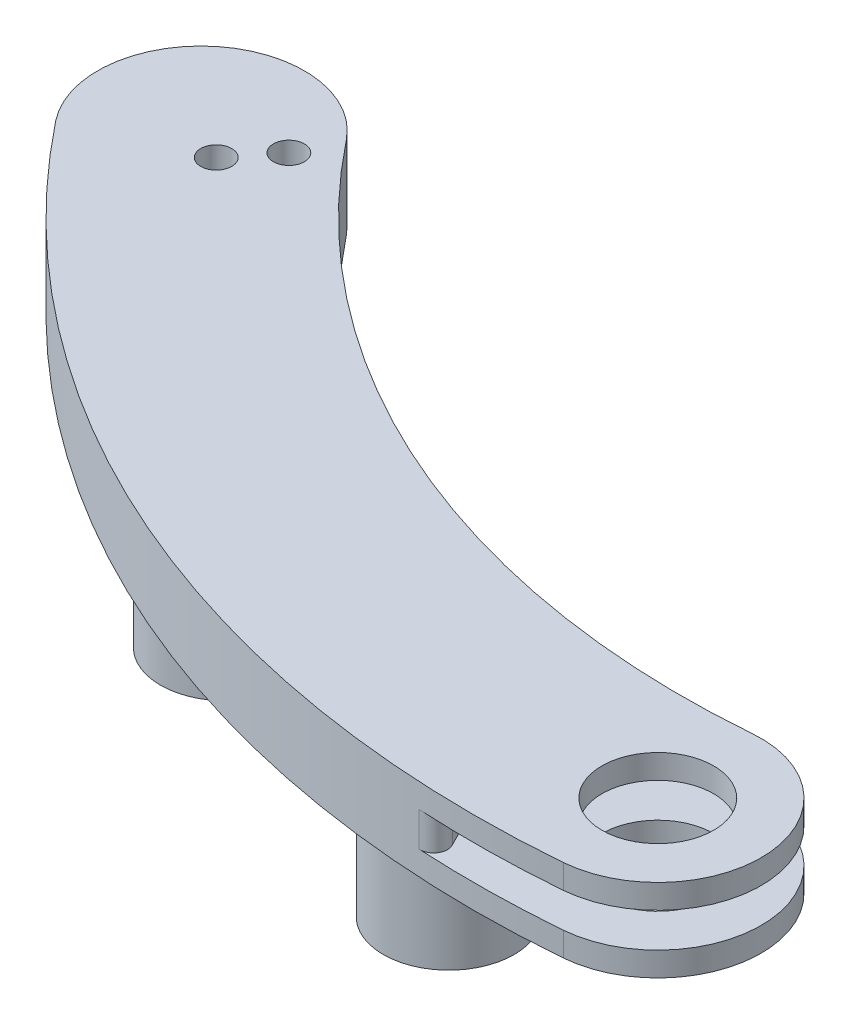
ISO-10303-21;
HEADER;
FILE_DESCRIPTION(('STEP AP214'),'2;1');
FILE_NAME('part.step','',(''),(''),'','','');
FILE_SCHEMA(('AUTOMOTIVE_DESIGN { 1 0 10303 214 1 1 1 1 }'));
ENDSEC;
DATA;
#1=APPLICATION_CONTEXT('core data for automotive mechanical design processes');
#2=APPLICATION_PROTOCOL_DEFINITION('international standard','automotive_design',2000,#1);
#3=PRODUCT_CONTEXT('',#1,'mechanical');
#4=PRODUCT('Part','Part','',(#3));
#5=PRODUCT_RELATED_PRODUCT_CATEGORY('part','',(#4));
#6=PRODUCT_DEFINITION_FORMATION('','',#4);
#7=PRODUCT_DEFINITION_CONTEXT('part definition',#1,'design');
#8=PRODUCT_DEFINITION('design','',#6,#7);
#9=PRODUCT_DEFINITION_SHAPE('','',#8);
#10=(LENGTH_UNIT() NAMED_UNIT(*) SI_UNIT(.MILLI.,.METRE.));
#11=(NAMED_UNIT(*) PLANE_ANGLE_UNIT() SI_UNIT($,.RADIAN.));
#12=(NAMED_UNIT(*) SI_UNIT($,.STERADIAN.) SOLID_ANGLE_UNIT());
#13=UNCERTAINTY_MEASURE_WITH_UNIT(LENGTH_MEASURE(1.E-05),#10,'distance_accuracy_value','');
#14=(GEOMETRIC_REPRESENTATION_CONTEXT(3) GLOBAL_UNCERTAINTY_ASSIGNED_CONTEXT((#13)) GLOBAL_UNIT_ASSIGNED_CONTEXT((#10,
#11,#12)) REPRESENTATION_CONTEXT('',''));
#15=CARTESIAN_POINT('',(0.,0.,0.));
#16=DIRECTION('',(0.,0.,1.));
#17=DIRECTION('',(1.,0.,0.));
#18=AXIS2_PLACEMENT_3D('',#15,#16,#17);
#19=CARTESIAN_POINT('',(-11.1561222970679,12.,-134.5382508259));
#20=DIRECTION('',(0.,-1.,0.));
#21=DIRECTION('',(0.,0.,-1.));
#22=AXIS2_PLACEMENT_3D('',#19,#20,#21);
#23=CYLINDRICAL_SURFACE('',#22,120.);
#24=DIRECTION('',(0.,-1.,0.));
#25=VECTOR('',#24,1.);
#26=CARTESIAN_POINT('',(-23.8009389622773,12.,-15.2063246221251));
#27=LINE('',#26,#25);
#28=CARTESIAN_POINT('',(-23.8009389622773,8.5,-15.2063246221251));
#29=VERTEX_POINT('',#28);
#30=CARTESIAN_POINT('',(-23.8009389622773,3.5,-15.2063246221251));
#31=VERTEX_POINT('',#30);
#32=EDGE_CURVE('E201',#29,#31,#27,.T.);
#33=ORIENTED_EDGE('',*,*,#32,.T.);
#34=CARTESIAN_POINT('',(-11.1561222970679,3.5,-134.5382508259));
#35=DIRECTION('',(0.,1.,0.));
#36=DIRECTION('',(0.,0.,1.));
#37=AXIS2_PLACEMENT_3D('',#34,#35,#36);
#38=CIRCLE('',#37,120.);
#39=CARTESIAN_POINT('',(-1.23956914411867,3.5,-14.9486945362111));
#40=VERTEX_POINT('',#39);
#41=EDGE_CURVE('E151',#31,#40,#38,.T.);
#42=ORIENTED_EDGE('',*,*,#41,.T.);
#43=DIRECTION('',(0.,-1.,0.));
#44=VECTOR('',#43,1.);
#45=CARTESIAN_POINT('',(-1.23956914411867,3.5,-14.9486945362111));
#46=LINE('',#45,#44);
#47=CARTESIAN_POINT('',(-1.23956914411867,0.,-14.9486945362111));
#48=VERTEX_POINT('',#47);
#49=EDGE_CURVE('E138',#40,#48,#46,.T.);
#50=ORIENTED_EDGE('',*,*,#49,.T.);
#51=CARTESIAN_POINT('',(-11.1561222970679,0.,-134.5382508259));
#52=DIRECTION('',(0.,1.,0.));
#53=DIRECTION('',(0.,0.,1.));
#54=AXIS2_PLACEMENT_3D('',#51,#52,#53);
#55=CIRCLE('',#54,120.);
#56=CARTESIAN_POINT('',(-105.239569144119,0.,-60.0513054637889));
#57=VERTEX_POINT('',#56);
#58=EDGE_CURVE('E178',#57,#48,#55,.T.);
#59=ORIENTED_EDGE('',*,*,#58,.F.);
#60=DIRECTION('',(0.,-1.,0.));
#61=VECTOR('',#60,1.);
#62=CARTESIAN_POINT('',(-105.239569144119,12.,-60.0513054637889));
#63=LINE('',#62,#61);
#64=CARTESIAN_POINT('',(-105.239569144119,12.,-60.0513054637889));
#65=VERTEX_POINT('',#64);
#66=EDGE_CURVE('E198',#65,#57,#63,.T.);
#67=ORIENTED_EDGE('',*,*,#66,.F.);
#68=CARTESIAN_POINT('',(-11.1561222970679,12.,-134.5382508259));
#69=DIRECTION('',(0.,1.,0.));
#70=DIRECTION('',(0.,0.,1.));
#71=AXIS2_PLACEMENT_3D('',#68,#69,#70);
#72=CIRCLE('',#71,120.);
#73=CARTESIAN_POINT('',(-1.23956914411867,12.,-14.9486945362111));
#74=VERTEX_POINT('',#73);
#75=EDGE_CURVE('E179',#65,#74,#72,.T.);
#76=ORIENTED_EDGE('',*,*,#75,.T.);
#77=DIRECTION('',(0.,-1.,0.));
#78=VECTOR('',#77,1.);
#79=CARTESIAN_POINT('',(-1.23956914411867,3.5,-14.9486945362111));
#80=LINE('',#79,#78);
#81=CARTESIAN_POINT('',(-1.23956914411867,8.5,-14.9486945362111));
#82=VERTEX_POINT('',#81);
#83=EDGE_CURVE('E170',#74,#82,#80,.T.);
#84=ORIENTED_EDGE('',*,*,#83,.T.);
#85=CARTESIAN_POINT('',(-11.1561222970679,8.5,-134.5382508259));
#86=DIRECTION('',(0.,1.,0.));
#87=DIRECTION('',(0.,0.,1.));
#88=AXIS2_PLACEMENT_3D('',#85,#86,#87);
#89=CIRCLE('',#88,120.);
#90=EDGE_CURVE('E137',#29,#82,#89,.T.);
#91=ORIENTED_EDGE('',*,*,#90,.F.);
#92=EDGE_LOOP('',(#33,#42,#50,#59,#67,#76,#84,#91));
#93=FACE_BOUND('',#92,.T.);
#94=ADVANCED_FACE('F41',(#93),#23,.F.);
#95=CARTESIAN_POINT('',(-11.1561222970679,12.,-134.5382508259));
#96=DIRECTION('',(0.,-1.,0.));
#97=DIRECTION('',(0.,0.,-1.));
#98=AXIS2_PLACEMENT_3D('',#95,#96,#97);
#99=CYLINDRICAL_SURFACE('',#98,150.);
#100=CARTESIAN_POINT('',(-11.1561222970679,3.5,-134.5382508259));
#101=DIRECTION('',(0.,1.,0.));
#102=DIRECTION('',(0.,0.,1.));
#103=AXIS2_PLACEMENT_3D('',#100,#101,#102);
#104=CIRCLE('',#103,150.);
#105=CARTESIAN_POINT('',(-19.3809595649369,3.5,15.2360862679993));
#106=VERTEX_POINT('',#105);
#107=CARTESIAN_POINT('',(1.23956914411865,3.5,14.9486945362112));
#108=VERTEX_POINT('',#107);
#109=EDGE_CURVE('E57',#106,#108,#104,.T.);
#110=ORIENTED_EDGE('',*,*,#109,.F.);
#111=DIRECTION('',(0.,-1.,0.));
#112=VECTOR('',#111,1.);
#113=CARTESIAN_POINT('',(-19.3809595649369,12.,15.2360862679993));
#114=LINE('',#113,#112);
#115=CARTESIAN_POINT('',(-19.3809595649369,8.5,15.2360862679993));
#116=VERTEX_POINT('',#115);
#117=EDGE_CURVE('E224',#106,#116,#114,.F.);
#118=ORIENTED_EDGE('',*,*,#117,.T.);
#119=CARTESIAN_POINT('',(-11.1561222970679,8.5,-134.5382508259));
#120=DIRECTION('',(0.,1.,0.));
#121=DIRECTION('',(0.,0.,1.));
#122=AXIS2_PLACEMENT_3D('',#119,#120,#121);
#123=CIRCLE('',#122,150.);
#124=CARTESIAN_POINT('',(1.23956914411865,8.5,14.9486945362112));
#125=VERTEX_POINT('',#124);
#126=EDGE_CURVE('E65',#116,#125,#123,.T.);
#127=ORIENTED_EDGE('',*,*,#126,.T.);
#128=DIRECTION('',(0.,-1.,0.));
#129=VECTOR('',#128,1.);
#130=CARTESIAN_POINT('',(1.23956914411865,3.5,14.9486945362112));
#131=LINE('',#130,#129);
#132=CARTESIAN_POINT('',(1.23956914411865,12.,14.9486945362112));
#133=VERTEX_POINT('',#132);
#134=EDGE_CURVE('E174',#133,#125,#131,.T.);
#135=ORIENTED_EDGE('',*,*,#134,.F.);
#136=CARTESIAN_POINT('',(-11.1561222970679,12.,-134.5382508259));
#137=DIRECTION('',(0.,1.,0.));
#138=DIRECTION('',(0.,0.,1.));
#139=AXIS2_PLACEMENT_3D('',#136,#137,#138);
#140=CIRCLE('',#139,150.);
#141=CARTESIAN_POINT('',(-128.760430855881,12.,-41.429569123261));
#142=VERTEX_POINT('',#141);
#143=EDGE_CURVE('E185',#142,#133,#140,.T.);
#144=ORIENTED_EDGE('',*,*,#143,.F.);
#145=DIRECTION('',(0.,-1.,0.));
#146=VECTOR('',#145,1.);
#147=CARTESIAN_POINT('',(-128.760430855881,12.,-41.429569123261));
#148=LINE('',#147,#146);
#149=CARTESIAN_POINT('',(-128.760430855881,0.,-41.429569123261));
#150=VERTEX_POINT('',#149);
#151=EDGE_CURVE('E188',#142,#150,#148,.T.);
#152=ORIENTED_EDGE('',*,*,#151,.T.);
#153=CARTESIAN_POINT('',(-11.1561222970679,0.,-134.5382508259));
#154=DIRECTION('',(0.,1.,0.));
#155=DIRECTION('',(0.,0.,1.));
#156=AXIS2_PLACEMENT_3D('',#153,#154,#155);
#157=CIRCLE('',#156,150.);
#158=CARTESIAN_POINT('',(1.23956914411865,0.,14.9486945362112));
#159=VERTEX_POINT('',#158);
#160=EDGE_CURVE('E132',#150,#159,#157,.T.);
#161=ORIENTED_EDGE('',*,*,#160,.T.);
#162=DIRECTION('',(0.,-1.,0.));
#163=VECTOR('',#162,1.);
#164=CARTESIAN_POINT('',(1.23956914411865,3.5,14.9486945362112));
#165=LINE('',#164,#163);
#166=EDGE_CURVE('E128',#108,#159,#165,.T.);
#167=ORIENTED_EDGE('',*,*,#166,.F.);
#168=EDGE_LOOP('',(#110,#118,#127,#135,#144,#152,#161,#167));
#169=FACE_BOUND('',#168,.T.);
#170=ADVANCED_FACE('F129',(#169),#99,.T.);
#171=CARTESIAN_POINT('',(-117.,12.,-50.7404372935249));
#172=DIRECTION('',(0.,-1.,0.));
#173=DIRECTION('',(0.,0.,-1.));
#174=AXIS2_PLACEMENT_3D('',#171,#172,#173);
#175=CYLINDRICAL_SURFACE('',#174,15.);
#176=CARTESIAN_POINT('',(-117.,0.,-50.7404372935249));
#177=DIRECTION('',(0.,1.,0.));
#178=DIRECTION('',(0.,0.,1.));
#179=AXIS2_PLACEMENT_3D('',#176,#177,#178);
#180=CIRCLE('',#179,15.);
#181=EDGE_CURVE('E191',#57,#150,#180,.T.);
#182=ORIENTED_EDGE('',*,*,#181,.T.);
#183=ORIENTED_EDGE('',*,*,#151,.F.);
#184=CARTESIAN_POINT('',(-117.,12.,-50.7404372935249));
#185=DIRECTION('',(0.,1.,0.));
#186=DIRECTION('',(0.,0.,1.));
#187=AXIS2_PLACEMENT_3D('',#184,#185,#186);
#188=CIRCLE('',#187,15.);
#189=EDGE_CURVE('E182',#65,#142,#188,.T.);
#190=ORIENTED_EDGE('',*,*,#189,.F.);
#191=ORIENTED_EDGE('',*,*,#66,.T.);
#192=EDGE_LOOP('',(#182,#183,#190,#191));
#193=FACE_BOUND('',#192,.T.);
#194=ADVANCED_FACE('F268',(#193),#175,.T.);
#195=CARTESIAN_POINT('',(0.,12.,0.));
#196=DIRECTION('',(0.,1.,0.));
#197=DIRECTION('',(0.,0.,1.));
#198=AXIS2_PLACEMENT_3D('',#195,#196,#197);
#199=PLANE('',#198);
#200=CARTESIAN_POINT('',(-107.816607253969,12.,-54.3024904049805));
#201=DIRECTION('',(0.,1.,0.));
#202=DIRECTION('',(0.,0.,1.));
#203=AXIS2_PLACEMENT_3D('',#200,#201,#202);
#204=CIRCLE('',#203,2.25);
#205=CARTESIAN_POINT('',(-107.816607253969,12.,-52.0524904049805));
#206=VERTEX_POINT('',#205);
#207=EDGE_CURVE('E331',#206,#206,#204,.T.);
#208=ORIENTED_EDGE('',*,*,#207,.F.);
#209=EDGE_LOOP('',(#208));
#210=FACE_BOUND('',#209,.T.);
#211=CARTESIAN_POINT('',(-112.49908312254,12.,-48.4437857921633));
#212=DIRECTION('',(0.,1.,0.));
#213=DIRECTION('',(0.,0.,1.));
#214=AXIS2_PLACEMENT_3D('',#211,#212,#213);
#215=CIRCLE('',#214,2.25);
#216=CARTESIAN_POINT('',(-112.49908312254,12.,-46.1937857921633));
#217=VERTEX_POINT('',#216);
#218=EDGE_CURVE('E322',#217,#217,#215,.T.);
#219=ORIENTED_EDGE('',*,*,#218,.F.);
#220=EDGE_LOOP('',(#219));
#221=FACE_BOUND('',#220,.T.);
#222=CARTESIAN_POINT('',(0.,12.,0.));
#223=DIRECTION('',(0.,1.,0.));
#224=DIRECTION('',(0.,0.,1.));
#225=AXIS2_PLACEMENT_3D('',#222,#223,#224);
#226=CIRCLE('',#225,8.1);
#227=CARTESIAN_POINT('',(0.,12.,8.1));
#228=VERTEX_POINT('',#227);
#229=EDGE_CURVE('E314',#228,#228,#226,.T.);
#230=ORIENTED_EDGE('',*,*,#229,.F.);
#231=EDGE_LOOP('',(#230));
#232=FACE_BOUND('',#231,.T.);
#233=ORIENTED_EDGE('',*,*,#143,.T.);
#234=CARTESIAN_POINT('',(0.,12.,0.));
#235=DIRECTION('',(0.,1.,0.));
#236=DIRECTION('',(0.,0.,1.));
#237=AXIS2_PLACEMENT_3D('',#234,#235,#236);
#238=CIRCLE('',#237,15.);
#239=EDGE_CURVE('E166',#133,#74,#238,.T.);
#240=ORIENTED_EDGE('',*,*,#239,.T.);
#241=ORIENTED_EDGE('',*,*,#75,.F.);
#242=ORIENTED_EDGE('',*,*,#189,.T.);
#243=EDGE_LOOP('',(#233,#240,#241,#242));
#244=FACE_BOUND('',#243,.T.);
#245=ADVANCED_FACE('F257',(#210,#221,#232,#244),#199,.T.);
#246=CARTESIAN_POINT('',(0.,0.,0.));
#247=DIRECTION('',(0.,1.,0.));
#248=DIRECTION('',(0.,0.,1.));
#249=AXIS2_PLACEMENT_3D('',#246,#247,#248);
#250=PLANE('',#249);
#251=CARTESIAN_POINT('',(-82.2471679808014,0.,-19.6042898686989));
#252=DIRECTION('',(0.,1.,0.));
#253=DIRECTION('',(0.,0.,1.));
#254=AXIS2_PLACEMENT_3D('',#251,#252,#253);
#255=CIRCLE('',#254,9.49999999999999);
#256=CARTESIAN_POINT('',(-82.2471679808014,0.,-10.1042898686989));
#257=VERTEX_POINT('',#256);
#258=EDGE_CURVE('E350',#257,#257,#255,.T.);
#259=ORIENTED_EDGE('',*,*,#258,.T.);
#260=EDGE_LOOP('',(#259));
#261=FACE_BOUND('',#260,.T.);
#262=CARTESIAN_POINT('',(-32.2471679808014,0.,-1.92782648449302));
#263=DIRECTION('',(0.,1.,0.));
#264=DIRECTION('',(0.,0.,1.));
#265=AXIS2_PLACEMENT_3D('',#262,#263,#264);
#266=CIRCLE('',#265,9.5);
#267=CARTESIAN_POINT('',(-32.2471679808014,0.,7.57217351550698));
#268=VERTEX_POINT('',#267);
#269=EDGE_CURVE('E338',#268,#268,#266,.T.);
#270=ORIENTED_EDGE('',*,*,#269,.T.);
#271=EDGE_LOOP('',(#270));
#272=FACE_BOUND('',#271,.T.);
#273=CARTESIAN_POINT('',(-107.816607253969,0.,-54.3024904049805));
#274=DIRECTION('',(0.,1.,0.));
#275=DIRECTION('',(0.,0.,1.));
#276=AXIS2_PLACEMENT_3D('',#273,#274,#275);
#277=CIRCLE('',#276,2.25);
#278=CARTESIAN_POINT('',(-107.816607253969,0.,-52.0524904049805));
#279=VERTEX_POINT('',#278);
#280=EDGE_CURVE('E318',#279,#279,#277,.T.);
#281=ORIENTED_EDGE('',*,*,#280,.T.);
#282=EDGE_LOOP('',(#281));
#283=FACE_BOUND('',#282,.T.);
#284=CARTESIAN_POINT('',(-112.49908312254,0.,-48.4437857921633));
#285=DIRECTION('',(0.,1.,0.));
#286=DIRECTION('',(0.,0.,1.));
#287=AXIS2_PLACEMENT_3D('',#284,#285,#286);
#288=CIRCLE('',#287,2.25);
#289=CARTESIAN_POINT('',(-112.49908312254,0.,-46.1937857921633));
#290=VERTEX_POINT('',#289);
#291=EDGE_CURVE('E326',#290,#290,#288,.T.);
#292=ORIENTED_EDGE('',*,*,#291,.T.);
#293=EDGE_LOOP('',(#292));
#294=FACE_BOUND('',#293,.T.);
#295=CARTESIAN_POINT('',(0.,0.,0.));
#296=DIRECTION('',(0.,1.,0.));
#297=DIRECTION('',(0.,0.,1.));
#298=AXIS2_PLACEMENT_3D('',#295,#296,#297);
#299=CIRCLE('',#298,8.1);
#300=CARTESIAN_POINT('',(0.,0.,8.1));
#301=VERTEX_POINT('',#300);
#302=EDGE_CURVE('E206',#301,#301,#299,.T.);
#303=ORIENTED_EDGE('',*,*,#302,.T.);
#304=EDGE_LOOP('',(#303));
#305=FACE_BOUND('',#304,.T.);
#306=ORIENTED_EDGE('',*,*,#58,.T.);
#307=CARTESIAN_POINT('',(0.,0.,0.));
#308=DIRECTION('',(0.,1.,0.));
#309=DIRECTION('',(0.,0.,1.));
#310=AXIS2_PLACEMENT_3D('',#307,#308,#309);
#311=CIRCLE('',#310,15.);
#312=EDGE_CURVE('E149',#159,#48,#311,.T.);
#313=ORIENTED_EDGE('',*,*,#312,.F.);
#314=ORIENTED_EDGE('',*,*,#160,.F.);
#315=ORIENTED_EDGE('',*,*,#181,.F.);
#316=EDGE_LOOP('',(#306,#313,#314,#315));
#317=FACE_BOUND('',#316,.T.);
#318=ADVANCED_FACE('F241',(#261,#272,#283,#294,#305,#317),#250,.F.);
#319=CARTESIAN_POINT('',(0.,3.5,0.));
#320=DIRECTION('',(0.,-1.,0.));
#321=DIRECTION('',(0.,0.,-1.));
#322=AXIS2_PLACEMENT_3D('',#319,#320,#321);
#323=CYLINDRICAL_SURFACE('',#322,15.);
#324=ORIENTED_EDGE('',*,*,#134,.T.);
#325=CARTESIAN_POINT('',(0.,8.5,0.));
#326=DIRECTION('',(0.,1.,0.));
#327=DIRECTION('',(0.,0.,1.));
#328=AXIS2_PLACEMENT_3D('',#325,#326,#327);
#329=CIRCLE('',#328,15.);
#330=EDGE_CURVE('E162',#125,#82,#329,.T.);
#331=ORIENTED_EDGE('',*,*,#330,.T.);
#332=ORIENTED_EDGE('',*,*,#83,.F.);
#333=ORIENTED_EDGE('',*,*,#239,.F.);
#334=EDGE_LOOP('',(#324,#331,#332,#333));
#335=FACE_BOUND('',#334,.T.);
#336=ADVANCED_FACE('F256',(#335),#323,.T.);
#337=CARTESIAN_POINT('',(4.94575057272327,8.5,-0.508204869290588));
#338=DIRECTION('',(0.,-1.,0.));
#339=DIRECTION('',(0.,0.,-1.));
#340=AXIS2_PLACEMENT_3D('',#337,#338,#339);
#341=CYLINDRICAL_SURFACE('',#340,25.8469667324395);
#342=CARTESIAN_POINT('',(4.94575057272327,8.5,-0.508204869290588));
#343=DIRECTION('',(0.,1.,0.));
#344=DIRECTION('',(0.,0.,1.));
#345=AXIS2_PLACEMENT_3D('',#342,#343,#344);
#346=CIRCLE('',#345,25.8469667324395);
#347=CARTESIAN_POINT('',(-19.5828410970926,8.5,-8.65767601552298));
#348=VERTEX_POINT('',#347);
#349=CARTESIAN_POINT('',(-17.5320000221163,8.5,12.2517487930087));
#350=VERTEX_POINT('',#349);
#351=EDGE_CURVE('E156',#348,#350,#346,.T.);
#352=ORIENTED_EDGE('',*,*,#351,.T.);
#353=DIRECTION('',(0.,-1.,0.));
#354=VECTOR('',#353,1.);
#355=CARTESIAN_POINT('',(-17.5320000221163,8.5,12.2517487930087));
#356=LINE('',#355,#354);
#357=CARTESIAN_POINT('',(-17.5320000221163,3.5,12.2517487930087));
#358=VERTEX_POINT('',#357);
#359=EDGE_CURVE('E220',#350,#358,#356,.T.);
#360=ORIENTED_EDGE('',*,*,#359,.T.);
#361=CARTESIAN_POINT('',(4.94575057272327,3.5,-0.508204869290588));
#362=DIRECTION('',(0.,1.,0.));
#363=DIRECTION('',(0.,0.,1.));
#364=AXIS2_PLACEMENT_3D('',#361,#362,#363);
#365=CIRCLE('',#364,25.8469667324395);
#366=CARTESIAN_POINT('',(-19.5828410970926,3.5,-8.65767601552298));
#367=VERTEX_POINT('',#366);
#368=EDGE_CURVE('E125',#367,#358,#365,.T.);
#369=ORIENTED_EDGE('',*,*,#368,.F.);
#370=DIRECTION('',(0.,-1.,0.));
#371=VECTOR('',#370,1.);
#372=CARTESIAN_POINT('',(-19.5828410970926,8.5,-8.65767601552298));
#373=LINE('',#372,#371);
#374=EDGE_CURVE('E210',#367,#348,#373,.F.);
#375=ORIENTED_EDGE('',*,*,#374,.T.);
#376=EDGE_LOOP('',(#352,#360,#369,#375));
#377=FACE_BOUND('',#376,.T.);
#378=ADVANCED_FACE('F292',(#377),#341,.F.);
#379=CARTESIAN_POINT('',(0.,8.5,0.));
#380=DIRECTION('',(0.,1.,0.));
#381=DIRECTION('',(0.,0.,1.));
#382=AXIS2_PLACEMENT_3D('',#379,#380,#381);
#383=PLANE('',#382);
#384=CARTESIAN_POINT('',(0.,8.5,0.));
#385=DIRECTION('',(0.,1.,0.));
#386=DIRECTION('',(0.,0.,1.));
#387=AXIS2_PLACEMENT_3D('',#384,#385,#386);
#388=CIRCLE('',#387,8.1);
#389=CARTESIAN_POINT('',(0.,8.5,8.1));
#390=VERTEX_POINT('',#389);
#391=EDGE_CURVE('E152',#390,#390,#388,.T.);
#392=ORIENTED_EDGE('',*,*,#391,.T.);
#393=EDGE_LOOP('',(#392));
#394=FACE_BOUND('',#393,.T.);
#395=ORIENTED_EDGE('',*,*,#90,.T.);
#396=ORIENTED_EDGE('',*,*,#330,.F.);
#397=ORIENTED_EDGE('',*,*,#126,.F.);
#398=CARTESIAN_POINT('',(-19.271295068032,8.5,13.2390951067473));
#399=DIRECTION('',(0.,1.,0.));
#400=DIRECTION('',(0.,0.,1.));
#401=AXIS2_PLACEMENT_3D('',#398,#399,#400);
#402=CIRCLE('',#401,2.);
#403=EDGE_CURVE('E229',#116,#350,#402,.T.);
#404=ORIENTED_EDGE('',*,*,#403,.T.);
#405=ORIENTED_EDGE('',*,*,#351,.F.);
#406=CARTESIAN_POINT('',(-24.3278063233277,8.5,-10.2341610303012));
#407=DIRECTION('',(0.,1.,0.));
#408=DIRECTION('',(0.,0.,1.));
#409=AXIS2_PLACEMENT_3D('',#406,#407,#408);
#410=CIRCLE('',#409,5.);
#411=EDGE_CURVE('E216',#348,#29,#410,.T.);
#412=ORIENTED_EDGE('',*,*,#411,.T.);
#413=EDGE_LOOP('',(#395,#396,#397,#404,#405,#412));
#414=FACE_BOUND('',#413,.T.);
#415=ADVANCED_FACE('F288',(#394,#414),#383,.F.);
#416=CARTESIAN_POINT('',(0.,3.5,0.));
#417=DIRECTION('',(0.,-1.,0.));
#418=DIRECTION('',(0.,0.,-1.));
#419=AXIS2_PLACEMENT_3D('',#416,#417,#418);
#420=CYLINDRICAL_SURFACE('',#419,15.);
#421=ORIENTED_EDGE('',*,*,#312,.T.);
#422=ORIENTED_EDGE('',*,*,#49,.F.);
#423=CARTESIAN_POINT('',(0.,3.5,0.));
#424=DIRECTION('',(0.,1.,0.));
#425=DIRECTION('',(0.,0.,1.));
#426=AXIS2_PLACEMENT_3D('',#423,#424,#425);
#427=CIRCLE('',#426,15.);
#428=EDGE_CURVE('E119',#108,#40,#427,.T.);
#429=ORIENTED_EDGE('',*,*,#428,.F.);
#430=ORIENTED_EDGE('',*,*,#166,.T.);
#431=EDGE_LOOP('',(#421,#422,#429,#430));
#432=FACE_BOUND('',#431,.T.);
#433=ADVANCED_FACE('F140',(#432),#420,.T.);
#434=CARTESIAN_POINT('',(0.,3.5,0.));
#435=DIRECTION('',(0.,1.,0.));
#436=DIRECTION('',(0.,0.,1.));
#437=AXIS2_PLACEMENT_3D('',#434,#435,#436);
#438=PLANE('',#437);
#439=CARTESIAN_POINT('',(0.,3.5,0.));
#440=DIRECTION('',(0.,1.,0.));
#441=DIRECTION('',(0.,0.,1.));
#442=AXIS2_PLACEMENT_3D('',#439,#440,#441);
#443=CIRCLE('',#442,8.1);
#444=CARTESIAN_POINT('',(0.,3.5,8.1));
#445=VERTEX_POINT('',#444);
#446=EDGE_CURVE('E202',#445,#445,#443,.T.);
#447=ORIENTED_EDGE('',*,*,#446,.F.);
#448=EDGE_LOOP('',(#447));
#449=FACE_BOUND('',#448,.T.);
#450=ORIENTED_EDGE('',*,*,#41,.F.);
#451=CARTESIAN_POINT('',(-24.3278063233277,3.5,-10.2341610303012));
#452=DIRECTION('',(0.,1.,0.));
#453=DIRECTION('',(0.,0.,1.));
#454=AXIS2_PLACEMENT_3D('',#451,#452,#453);
#455=CIRCLE('',#454,5.);
#456=EDGE_CURVE('E213',#31,#367,#455,.F.);
#457=ORIENTED_EDGE('',*,*,#456,.T.);
#458=ORIENTED_EDGE('',*,*,#368,.T.);
#459=CARTESIAN_POINT('',(-19.271295068032,3.5,13.2390951067473));
#460=DIRECTION('',(0.,1.,0.));
#461=DIRECTION('',(0.,0.,1.));
#462=AXIS2_PLACEMENT_3D('',#459,#460,#461);
#463=CIRCLE('',#462,2.);
#464=EDGE_CURVE('E122',#358,#106,#463,.F.);
#465=ORIENTED_EDGE('',*,*,#464,.T.);
#466=ORIENTED_EDGE('',*,*,#109,.T.);
#467=ORIENTED_EDGE('',*,*,#428,.T.);
#468=EDGE_LOOP('',(#450,#457,#458,#465,#466,#467));
#469=FACE_BOUND('',#468,.T.);
#470=ADVANCED_FACE('F117',(#449,#469),#438,.T.);
#471=CARTESIAN_POINT('',(0.,0.,0.));
#472=DIRECTION('',(0.,1.,0.));
#473=DIRECTION('',(0.,0.,1.));
#474=AXIS2_PLACEMENT_3D('',#471,#472,#473);
#475=CYLINDRICAL_SURFACE('',#474,8.1);
#476=ORIENTED_EDGE('',*,*,#446,.T.);
#477=EDGE_LOOP('',(#476));
#478=FACE_BOUND('',#477,.T.);
#479=ORIENTED_EDGE('',*,*,#302,.F.);
#480=EDGE_LOOP('',(#479));
#481=FACE_BOUND('',#480,.T.);
#482=ADVANCED_FACE('F280',(#478,#481),#475,.F.);
#483=ORIENTED_EDGE('',*,*,#229,.T.);
#484=EDGE_LOOP('',(#483));
#485=FACE_BOUND('',#484,.T.);
#486=ORIENTED_EDGE('',*,*,#391,.F.);
#487=EDGE_LOOP('',(#486));
#488=FACE_BOUND('',#487,.T.);
#489=ADVANCED_FACE('F272',(#485,#488),#475,.F.);
#490=CARTESIAN_POINT('',(-24.3278063233277,8.5,-10.2341610303012));
#491=DIRECTION('',(0.,-1.,0.));
#492=DIRECTION('',(0.,0.,-1.));
#493=AXIS2_PLACEMENT_3D('',#490,#491,#492);
#494=CYLINDRICAL_SURFACE('',#493,5.);
#495=ORIENTED_EDGE('',*,*,#411,.F.);
#496=ORIENTED_EDGE('',*,*,#374,.F.);
#497=ORIENTED_EDGE('',*,*,#456,.F.);
#498=ORIENTED_EDGE('',*,*,#32,.F.);
#499=EDGE_LOOP('',(#495,#496,#497,#498));
#500=FACE_BOUND('',#499,.T.);
#501=ADVANCED_FACE('F270',(#500),#494,.T.);
#502=CARTESIAN_POINT('',(-19.271295068032,12.,13.2390951067473));
#503=DIRECTION('',(0.,1.,0.));
#504=DIRECTION('',(0.,0.,1.));
#505=AXIS2_PLACEMENT_3D('',#502,#503,#504);
#506=CYLINDRICAL_SURFACE('',#505,2.);
#507=ORIENTED_EDGE('',*,*,#403,.F.);
#508=ORIENTED_EDGE('',*,*,#117,.F.);
#509=ORIENTED_EDGE('',*,*,#464,.F.);
#510=ORIENTED_EDGE('',*,*,#359,.F.);
#511=EDGE_LOOP('',(#507,#508,#509,#510));
#512=FACE_BOUND('',#511,.T.);
#513=ADVANCED_FACE('F43',(#512),#506,.T.);
#514=CARTESIAN_POINT('',(-112.49908312254,0.,-48.4437857921633));
#515=DIRECTION('',(0.,1.,0.));
#516=DIRECTION('',(0.,0.,1.));
#517=AXIS2_PLACEMENT_3D('',#514,#515,#516);
#518=CYLINDRICAL_SURFACE('',#517,2.25);
#519=ORIENTED_EDGE('',*,*,#291,.F.);
#520=EDGE_LOOP('',(#519));
#521=FACE_BOUND('',#520,.T.);
#522=ORIENTED_EDGE('',*,*,#218,.T.);
#523=EDGE_LOOP('',(#522));
#524=FACE_BOUND('',#523,.T.);
#525=ADVANCED_FACE('F278',(#521,#524),#518,.F.);
#526=CARTESIAN_POINT('',(-107.816607253969,0.,-54.3024904049805));
#527=DIRECTION('',(0.,1.,0.));
#528=DIRECTION('',(0.,0.,1.));
#529=AXIS2_PLACEMENT_3D('',#526,#527,#528);
#530=CYLINDRICAL_SURFACE('',#529,2.25);
#531=ORIENTED_EDGE('',*,*,#280,.F.);
#532=EDGE_LOOP('',(#531));
#533=FACE_BOUND('',#532,.T.);
#534=ORIENTED_EDGE('',*,*,#207,.T.);
#535=EDGE_LOOP('',(#534));
#536=FACE_BOUND('',#535,.T.);
#537=ADVANCED_FACE('F379',(#533,#536),#530,.F.);
#538=CARTESIAN_POINT('',(-32.2471679808014,-20.,-1.92782648449302));
#539=DIRECTION('',(0.,1.,0.));
#540=DIRECTION('',(0.,0.,1.));
#541=AXIS2_PLACEMENT_3D('',#538,#539,#540);
#542=CYLINDRICAL_SURFACE('',#541,9.5);
#543=CARTESIAN_POINT('',(-32.2471679808014,-20.,-1.92782648449302));
#544=DIRECTION('',(0.,1.,0.));
#545=DIRECTION('',(0.,0.,1.));
#546=AXIS2_PLACEMENT_3D('',#543,#544,#545);
#547=CIRCLE('',#546,9.5);
#548=CARTESIAN_POINT('',(-32.2471679808014,-20.,7.57217351550698));
#549=VERTEX_POINT('',#548);
#550=EDGE_CURVE('E327',#549,#549,#547,.T.);
#551=ORIENTED_EDGE('',*,*,#550,.T.);
#552=EDGE_LOOP('',(#551));
#553=FACE_BOUND('',#552,.T.);
#554=ORIENTED_EDGE('',*,*,#269,.F.);
#555=EDGE_LOOP('',(#554));
#556=FACE_BOUND('',#555,.T.);
#557=ADVANCED_FACE('F375',(#553,#556),#542,.T.);
#558=CARTESIAN_POINT('',(-32.2471679808014,-20.,-1.92782648449302));
#559=DIRECTION('',(0.,1.,0.));
#560=DIRECTION('',(0.,0.,1.));
#561=AXIS2_PLACEMENT_3D('',#558,#559,#560);
#562=PLANE('',#561);
#563=CARTESIAN_POINT('',(-32.2471679808014,-20.,-1.92782648449302));
#564=DIRECTION('',(0.,1.,0.));
#565=DIRECTION('',(0.,0.,1.));
#566=AXIS2_PLACEMENT_3D('',#563,#564,#565);
#567=CIRCLE('',#566,8.1);
#568=CARTESIAN_POINT('',(-32.2471679808014,-20.,6.17217351550698));
#569=VERTEX_POINT('',#568);
#570=EDGE_CURVE('E342',#569,#569,#567,.T.);
#571=ORIENTED_EDGE('',*,*,#570,.T.);
#572=EDGE_LOOP('',(#571));
#573=FACE_BOUND('',#572,.T.);
#574=ORIENTED_EDGE('',*,*,#550,.F.);
#575=EDGE_LOOP('',(#574));
#576=FACE_BOUND('',#575,.T.);
#577=ADVANCED_FACE('F250',(#573,#576),#562,.F.);
#578=CARTESIAN_POINT('',(-32.2471679808014,-20.,-1.92782648449302));
#579=DIRECTION('',(0.,1.,0.));
#580=DIRECTION('',(0.,0.,1.));
#581=AXIS2_PLACEMENT_3D('',#578,#579,#580);
#582=CYLINDRICAL_SURFACE('',#581,8.1);
#583=ORIENTED_EDGE('',*,*,#570,.F.);
#584=EDGE_LOOP('',(#583));
#585=FACE_BOUND('',#584,.T.);
#586=CARTESIAN_POINT('',(-32.2471679808014,0.,-1.92782648449302));
#587=DIRECTION('',(0.,1.,0.));
#588=DIRECTION('',(0.,0.,1.));
#589=AXIS2_PLACEMENT_3D('',#586,#587,#588);
#590=CIRCLE('',#589,8.1);
#591=CARTESIAN_POINT('',(-32.2471679808014,0.,6.17217351550698));
#592=VERTEX_POINT('',#591);
#593=EDGE_CURVE('E50',#592,#592,#590,.T.);
#594=ORIENTED_EDGE('',*,*,#593,.T.);
#595=EDGE_LOOP('',(#594));
#596=FACE_BOUND('',#595,.T.);
#597=ADVANCED_FACE('F235',(#585,#596),#582,.F.);
#598=ORIENTED_EDGE('',*,*,#593,.F.);
#599=EDGE_LOOP('',(#598));
#600=FACE_BOUND('',#599,.T.);
#601=ADVANCED_FACE('F237',(#600),#250,.F.);
#602=CARTESIAN_POINT('',(-82.2471679808014,-20.,-19.6042898686989));
#603=DIRECTION('',(0.,1.,0.));
#604=DIRECTION('',(0.,0.,1.));
#605=AXIS2_PLACEMENT_3D('',#602,#603,#604);
#606=CYLINDRICAL_SURFACE('',#605,9.49999999999999);
#607=CARTESIAN_POINT('',(-82.2471679808014,-20.,-19.6042898686989));
#608=DIRECTION('',(0.,1.,0.));
#609=DIRECTION('',(0.,0.,1.));
#610=AXIS2_PLACEMENT_3D('',#607,#608,#609);
#611=CIRCLE('',#610,9.49999999999999);
#612=CARTESIAN_POINT('',(-82.2471679808014,-20.,-10.1042898686989));
#613=VERTEX_POINT('',#612);
#614=EDGE_CURVE('E349',#613,#613,#611,.T.);
#615=ORIENTED_EDGE('',*,*,#614,.T.);
#616=EDGE_LOOP('',(#615));
#617=FACE_BOUND('',#616,.T.);
#618=ORIENTED_EDGE('',*,*,#258,.F.);
#619=EDGE_LOOP('',(#618));
#620=FACE_BOUND('',#619,.T.);
#621=ADVANCED_FACE('F239',(#617,#620),#606,.T.);
#622=CARTESIAN_POINT('',(-82.2471679808014,-20.,-19.6042898686989));
#623=DIRECTION('',(0.,1.,0.));
#624=DIRECTION('',(0.,0.,1.));
#625=AXIS2_PLACEMENT_3D('',#622,#623,#624);
#626=PLANE('',#625);
#627=CARTESIAN_POINT('',(-82.2471679808014,-20.,-19.6042898686989));
#628=DIRECTION('',(0.,1.,0.));
#629=DIRECTION('',(0.,0.,1.));
#630=AXIS2_PLACEMENT_3D('',#627,#628,#629);
#631=CIRCLE('',#630,8.09999999999999);
#632=CARTESIAN_POINT('',(-82.2471679808014,-20.,-11.5042898686989));
#633=VERTEX_POINT('',#632);
#634=EDGE_CURVE('E354',#633,#633,#631,.T.);
#635=ORIENTED_EDGE('',*,*,#634,.T.);
#636=EDGE_LOOP('',(#635));
#637=FACE_BOUND('',#636,.T.);
#638=ORIENTED_EDGE('',*,*,#614,.F.);
#639=EDGE_LOOP('',(#638));
#640=FACE_BOUND('',#639,.T.);
#641=ADVANCED_FACE('F247',(#637,#640),#626,.F.);
#642=CARTESIAN_POINT('',(-82.2471679808014,-20.,-19.6042898686989));
#643=DIRECTION('',(0.,1.,0.));
#644=DIRECTION('',(0.,0.,1.));
#645=AXIS2_PLACEMENT_3D('',#642,#643,#644);
#646=CYLINDRICAL_SURFACE('',#645,8.09999999999999);
#647=ORIENTED_EDGE('',*,*,#634,.F.);
#648=EDGE_LOOP('',(#647));
#649=FACE_BOUND('',#648,.T.);
#650=CARTESIAN_POINT('',(-82.2471679808014,0.,-19.6042898686989));
#651=DIRECTION('',(0.,1.,0.));
#652=DIRECTION('',(0.,0.,1.));
#653=AXIS2_PLACEMENT_3D('',#650,#651,#652);
#654=CIRCLE('',#653,8.09999999999999);
#655=CARTESIAN_POINT('',(-82.2471679808014,0.,-11.5042898686989));
#656=VERTEX_POINT('',#655);
#657=EDGE_CURVE('E11',#656,#656,#654,.T.);
#658=ORIENTED_EDGE('',*,*,#657,.T.);
#659=EDGE_LOOP('',(#658));
#660=FACE_BOUND('',#659,.T.);
#661=ADVANCED_FACE('F260',(#649,#660),#646,.F.);
#662=ORIENTED_EDGE('',*,*,#657,.F.);
#663=EDGE_LOOP('',(#662));
#664=FACE_BOUND('',#663,.T.);
#665=ADVANCED_FACE('F242',(#664),#250,.F.);
#666=CLOSED_SHELL('',(#94,#170,#194,#245,#318,#336,#378,#415,#433,#470,#482,#489,#501,#513,#525,
#537,#557,#577,#597,#601,#621,#641,#661,#665));
#667=MANIFOLD_SOLID_BREP('B2',#666);
#668=ADVANCED_BREP_SHAPE_REPRESENTATION('',(#18,#667),#14);
#669=SHAPE_DEFINITION_REPRESENTATION(#9,#668);
ENDSEC;
END-ISO-10303-21;
